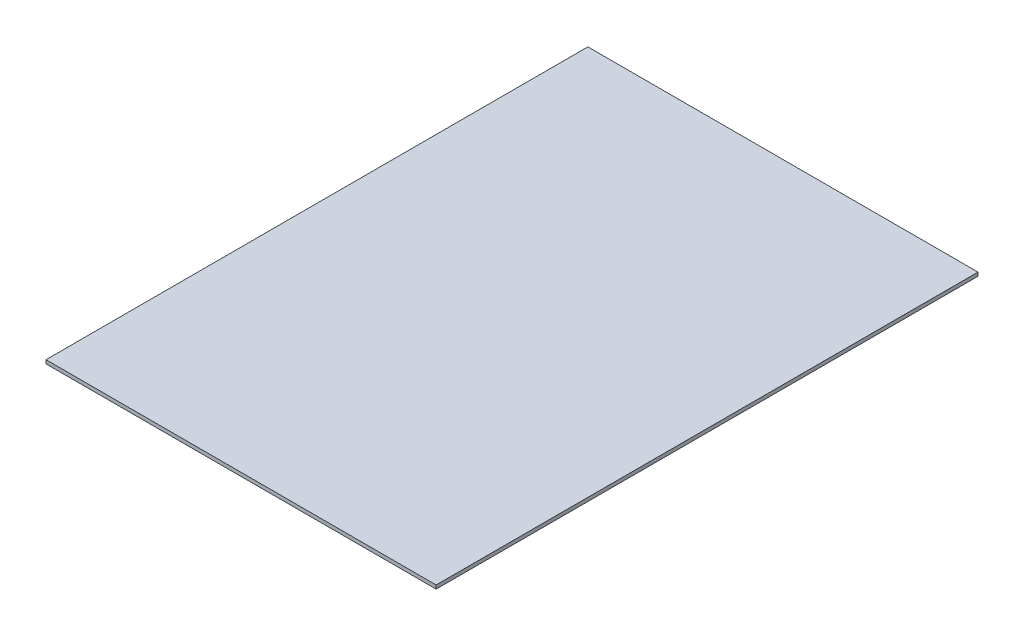
ISO-10303-21;
HEADER;
FILE_DESCRIPTION(('STEP AP214'),'2;1');
FILE_NAME('part.step','',(''),(''),'','','');
FILE_SCHEMA(('AUTOMOTIVE_DESIGN { 1 0 10303 214 1 1 1 1 }'));
ENDSEC;
DATA;
#1=APPLICATION_CONTEXT('core data for automotive mechanical design processes');
#2=APPLICATION_PROTOCOL_DEFINITION('international standard','automotive_design',2000,#1);
#3=PRODUCT_CONTEXT('',#1,'mechanical');
#4=PRODUCT('Part','Part','',(#3));
#5=PRODUCT_RELATED_PRODUCT_CATEGORY('part','',(#4));
#6=PRODUCT_DEFINITION_FORMATION('','',#4);
#7=PRODUCT_DEFINITION_CONTEXT('part definition',#1,'design');
#8=PRODUCT_DEFINITION('design','',#6,#7);
#9=PRODUCT_DEFINITION_SHAPE('','',#8);
#10=(LENGTH_UNIT() NAMED_UNIT(*) SI_UNIT(.MILLI.,.METRE.));
#11=(NAMED_UNIT(*) PLANE_ANGLE_UNIT() SI_UNIT($,.RADIAN.));
#12=(NAMED_UNIT(*) SI_UNIT($,.STERADIAN.) SOLID_ANGLE_UNIT());
#13=UNCERTAINTY_MEASURE_WITH_UNIT(LENGTH_MEASURE(1.E-05),#10,'distance_accuracy_value','');
#14=(GEOMETRIC_REPRESENTATION_CONTEXT(3) GLOBAL_UNCERTAINTY_ASSIGNED_CONTEXT((#13)) GLOBAL_UNIT_ASSIGNED_CONTEXT((#10,
#11,#12)) REPRESENTATION_CONTEXT('',''));
#15=CARTESIAN_POINT('',(0.,0.,0.));
#16=DIRECTION('',(0.,0.,1.));
#17=DIRECTION('',(1.,0.,0.));
#18=AXIS2_PLACEMENT_3D('',#15,#16,#17);
#19=CARTESIAN_POINT('',(0.,5.,0.));
#20=DIRECTION('',(-1.,0.,0.));
#21=DIRECTION('',(0.,0.,1.));
#22=AXIS2_PLACEMENT_3D('',#19,#20,#21);
#23=PLANE('',#22);
#24=DIRECTION('',(0.,0.,-1.));
#25=VECTOR('',#24,1.);
#26=CARTESIAN_POINT('',(0.,0.,0.));
#27=LINE('',#26,#25);
#28=CARTESIAN_POINT('',(0.,0.,750.));
#29=VERTEX_POINT('',#28);
#30=CARTESIAN_POINT('',(0.,0.,0.));
#31=VERTEX_POINT('',#30);
#32=EDGE_CURVE('E96',#29,#31,#27,.T.);
#33=ORIENTED_EDGE('',*,*,#32,.T.);
#34=DIRECTION('',(0.,-1.,0.));
#35=VECTOR('',#34,1.);
#36=CARTESIAN_POINT('',(0.,5.,0.));
#37=LINE('',#36,#35);
#38=CARTESIAN_POINT('',(0.,5.,0.));
#39=VERTEX_POINT('',#38);
#40=EDGE_CURVE('E11',#39,#31,#37,.T.);
#41=ORIENTED_EDGE('',*,*,#40,.F.);
#42=DIRECTION('',(0.,0.,-1.));
#43=VECTOR('',#42,1.);
#44=CARTESIAN_POINT('',(0.,5.,0.));
#45=LINE('',#44,#43);
#46=CARTESIAN_POINT('',(0.,5.,750.));
#47=VERTEX_POINT('',#46);
#48=EDGE_CURVE('E84',#47,#39,#45,.T.);
#49=ORIENTED_EDGE('',*,*,#48,.F.);
#50=DIRECTION('',(0.,-1.,0.));
#51=VECTOR('',#50,1.);
#52=CARTESIAN_POINT('',(0.,5.,750.));
#53=LINE('',#52,#51);
#54=EDGE_CURVE('E92',#47,#29,#53,.T.);
#55=ORIENTED_EDGE('',*,*,#54,.T.);
#56=EDGE_LOOP('',(#33,#41,#49,#55));
#57=FACE_BOUND('',#56,.T.);
#58=ADVANCED_FACE('F33',(#57),#23,.F.);
#59=CARTESIAN_POINT('',(0.,5.,0.));
#60=DIRECTION('',(0.,0.,1.));
#61=DIRECTION('',(1.,0.,0.));
#62=AXIS2_PLACEMENT_3D('',#59,#60,#61);
#63=PLANE('',#62);
#64=DIRECTION('',(-1.,0.,0.));
#65=VECTOR('',#64,1.);
#66=CARTESIAN_POINT('',(0.,0.,0.));
#67=LINE('',#66,#65);
#68=CARTESIAN_POINT('',(-540.,0.,0.));
#69=VERTEX_POINT('',#68);
#70=EDGE_CURVE('E88',#31,#69,#67,.T.);
#71=ORIENTED_EDGE('',*,*,#70,.T.);
#72=DIRECTION('',(0.,-1.,0.));
#73=VECTOR('',#72,1.);
#74=CARTESIAN_POINT('',(-540.,5.,0.));
#75=LINE('',#74,#73);
#76=CARTESIAN_POINT('',(-540.,5.,0.));
#77=VERTEX_POINT('',#76);
#78=EDGE_CURVE('E41',#77,#69,#75,.T.);
#79=ORIENTED_EDGE('',*,*,#78,.F.);
#80=DIRECTION('',(-1.,0.,0.));
#81=VECTOR('',#80,1.);
#82=CARTESIAN_POINT('',(0.,5.,0.));
#83=LINE('',#82,#81);
#84=EDGE_CURVE('E79',#39,#77,#83,.T.);
#85=ORIENTED_EDGE('',*,*,#84,.F.);
#86=ORIENTED_EDGE('',*,*,#40,.T.);
#87=EDGE_LOOP('',(#71,#79,#85,#86));
#88=FACE_BOUND('',#87,.T.);
#89=ADVANCED_FACE('F87',(#88),#63,.F.);
#90=CARTESIAN_POINT('',(-540.,5.,0.));
#91=DIRECTION('',(1.,0.,0.));
#92=DIRECTION('',(0.,0.,-1.));
#93=AXIS2_PLACEMENT_3D('',#90,#91,#92);
#94=PLANE('',#93);
#95=DIRECTION('',(0.,0.,1.));
#96=VECTOR('',#95,1.);
#97=CARTESIAN_POINT('',(-540.,0.,0.));
#98=LINE('',#97,#96);
#99=CARTESIAN_POINT('',(-540.,0.,750.));
#100=VERTEX_POINT('',#99);
#101=EDGE_CURVE('E66',#69,#100,#98,.T.);
#102=ORIENTED_EDGE('',*,*,#101,.T.);
#103=DIRECTION('',(0.,-1.,0.));
#104=VECTOR('',#103,1.);
#105=CARTESIAN_POINT('',(-540.,5.,750.));
#106=LINE('',#105,#104);
#107=CARTESIAN_POINT('',(-540.,5.,750.));
#108=VERTEX_POINT('',#107);
#109=EDGE_CURVE('E89',#108,#100,#106,.T.);
#110=ORIENTED_EDGE('',*,*,#109,.F.);
#111=DIRECTION('',(0.,0.,1.));
#112=VECTOR('',#111,1.);
#113=CARTESIAN_POINT('',(-540.,5.,0.));
#114=LINE('',#113,#112);
#115=EDGE_CURVE('E82',#77,#108,#114,.T.);
#116=ORIENTED_EDGE('',*,*,#115,.F.);
#117=ORIENTED_EDGE('',*,*,#78,.T.);
#118=EDGE_LOOP('',(#102,#110,#116,#117));
#119=FACE_BOUND('',#118,.T.);
#120=ADVANCED_FACE('F90',(#119),#94,.F.);
#121=CARTESIAN_POINT('',(0.,5.,750.));
#122=DIRECTION('',(0.,0.,-1.));
#123=DIRECTION('',(-1.,0.,0.));
#124=AXIS2_PLACEMENT_3D('',#121,#122,#123);
#125=PLANE('',#124);
#126=DIRECTION('',(1.,0.,0.));
#127=VECTOR('',#126,1.);
#128=CARTESIAN_POINT('',(0.,0.,750.));
#129=LINE('',#128,#127);
#130=EDGE_CURVE('E72',#100,#29,#129,.T.);
#131=ORIENTED_EDGE('',*,*,#130,.T.);
#132=ORIENTED_EDGE('',*,*,#54,.F.);
#133=DIRECTION('',(1.,0.,0.));
#134=VECTOR('',#133,1.);
#135=CARTESIAN_POINT('',(0.,5.,750.));
#136=LINE('',#135,#134);
#137=EDGE_CURVE('E49',#108,#47,#136,.T.);
#138=ORIENTED_EDGE('',*,*,#137,.F.);
#139=ORIENTED_EDGE('',*,*,#109,.T.);
#140=EDGE_LOOP('',(#131,#132,#138,#139));
#141=FACE_BOUND('',#140,.T.);
#142=ADVANCED_FACE('F103',(#141),#125,.F.);
#143=CARTESIAN_POINT('',(0.,5.,0.));
#144=DIRECTION('',(0.,-1.,0.));
#145=DIRECTION('',(0.,0.,-1.));
#146=AXIS2_PLACEMENT_3D('',#143,#144,#145);
#147=PLANE('',#146);
#148=ORIENTED_EDGE('',*,*,#48,.T.);
#149=ORIENTED_EDGE('',*,*,#84,.T.);
#150=ORIENTED_EDGE('',*,*,#115,.T.);
#151=ORIENTED_EDGE('',*,*,#137,.T.);
#152=EDGE_LOOP('',(#148,#149,#150,#151));
#153=FACE_BOUND('',#152,.T.);
#154=ADVANCED_FACE('F80',(#153),#147,.F.);
#155=CARTESIAN_POINT('',(0.,0.,0.));
#156=DIRECTION('',(0.,-1.,0.));
#157=DIRECTION('',(0.,0.,-1.));
#158=AXIS2_PLACEMENT_3D('',#155,#156,#157);
#159=PLANE('',#158);
#160=ORIENTED_EDGE('',*,*,#32,.F.);
#161=ORIENTED_EDGE('',*,*,#130,.F.);
#162=ORIENTED_EDGE('',*,*,#101,.F.);
#163=ORIENTED_EDGE('',*,*,#70,.F.);
#164=EDGE_LOOP('',(#160,#161,#162,#163));
#165=FACE_BOUND('',#164,.T.);
#166=ADVANCED_FACE('F106',(#165),#159,.T.);
#167=CLOSED_SHELL('',(#58,#89,#120,#142,#154,#166));
#168=MANIFOLD_SOLID_BREP('B2',#167);
#169=ADVANCED_BREP_SHAPE_REPRESENTATION('',(#18,#168),#14);
#170=SHAPE_DEFINITION_REPRESENTATION(#9,#169);
ENDSEC;
END-ISO-10303-21;
